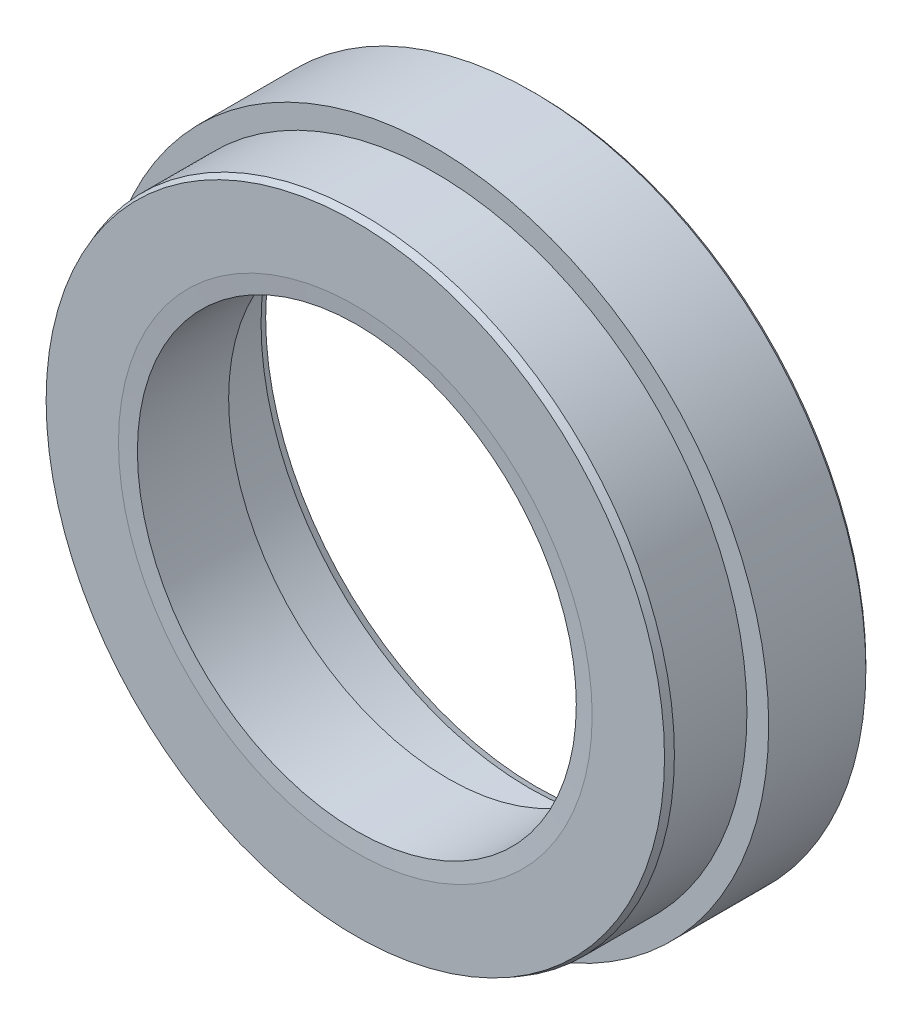
ISO-10303-21;
HEADER;
FILE_DESCRIPTION(('STEP AP214'),'2;1');
FILE_NAME('part.step','',(''),(''),'','','');
FILE_SCHEMA(('AUTOMOTIVE_DESIGN { 1 0 10303 214 1 1 1 1 }'));
ENDSEC;
DATA;
#1=APPLICATION_CONTEXT('core data for automotive mechanical design processes');
#2=APPLICATION_PROTOCOL_DEFINITION('international standard','automotive_design',2000,#1);
#3=PRODUCT_CONTEXT('',#1,'mechanical');
#4=PRODUCT('Part','Part','',(#3));
#5=PRODUCT_RELATED_PRODUCT_CATEGORY('part','',(#4));
#6=PRODUCT_DEFINITION_FORMATION('','',#4);
#7=PRODUCT_DEFINITION_CONTEXT('part definition',#1,'design');
#8=PRODUCT_DEFINITION('design','',#6,#7);
#9=PRODUCT_DEFINITION_SHAPE('','',#8);
#10=(LENGTH_UNIT() NAMED_UNIT(*) SI_UNIT(.MILLI.,.METRE.));
#11=(NAMED_UNIT(*) PLANE_ANGLE_UNIT() SI_UNIT($,.RADIAN.));
#12=(NAMED_UNIT(*) SI_UNIT($,.STERADIAN.) SOLID_ANGLE_UNIT());
#13=UNCERTAINTY_MEASURE_WITH_UNIT(LENGTH_MEASURE(1.E-05),#10,'distance_accuracy_value','');
#14=(GEOMETRIC_REPRESENTATION_CONTEXT(3) GLOBAL_UNCERTAINTY_ASSIGNED_CONTEXT((#13)) GLOBAL_UNIT_ASSIGNED_CONTEXT((#10,
#11,#12)) REPRESENTATION_CONTEXT('',''));
#15=CARTESIAN_POINT('',(0.,0.,0.));
#16=DIRECTION('',(0.,0.,1.));
#17=DIRECTION('',(1.,0.,0.));
#18=AXIS2_PLACEMENT_3D('',#15,#16,#17);
#19=CARTESIAN_POINT('',(7.940681222,19.1705003,5.));
#20=DIRECTION('',(0.,0.,1.));
#21=DIRECTION('',(1.,0.,0.));
#22=AXIS2_PLACEMENT_3D('',#19,#20,#21);
#23=PLANE('',#22);
#24=CARTESIAN_POINT('',(7.940681222,19.1705003,5.));
#25=DIRECTION('',(0.,0.,1.));
#26=DIRECTION('',(-1.,0.,0.));
#27=AXIS2_PLACEMENT_3D('',#24,#25,#26);
#28=CIRCLE('',#27,1.25);
#29=CARTESIAN_POINT('',(6.690681222,19.1705003,5.));
#30=VERTEX_POINT('',#29);
#31=EDGE_CURVE('E10',#30,#30,#28,.T.);
#32=ORIENTED_EDGE('',*,*,#31,.F.);
#33=EDGE_LOOP('',(#32));
#34=FACE_BOUND('',#33,.T.);
#35=ADVANCED_FACE('F15',(#34),#23,.F.);
#36=CARTESIAN_POINT('',(7.940681222,19.1705003,5.));
#37=DIRECTION('',(0.,0.,-1.));
#38=DIRECTION('',(-1.,0.,0.));
#39=AXIS2_PLACEMENT_3D('',#36,#37,#38);
#40=CYLINDRICAL_SURFACE('',#39,1.25);
#41=CARTESIAN_POINT('',(7.940681222,19.1705003,0.));
#42=DIRECTION('',(0.,0.,-1.));
#43=DIRECTION('',(-1.,-3.38987433679E-09,0.));
#44=AXIS2_PLACEMENT_3D('',#41,#42,#43);
#45=CIRCLE('',#44,1.25);
#46=CARTESIAN_POINT('',(6.690681222,19.1705002957627,0.));
#47=VERTEX_POINT('',#46);
#48=EDGE_CURVE('E35',#47,#47,#45,.T.);
#49=ORIENTED_EDGE('',*,*,#48,.T.);
#50=EDGE_LOOP('',(#49));
#51=FACE_BOUND('',#50,.T.);
#52=ORIENTED_EDGE('',*,*,#31,.T.);
#53=EDGE_LOOP('',(#52));
#54=FACE_BOUND('',#53,.T.);
#55=ADVANCED_FACE('F159',(#51,#54),#40,.F.);
#56=CARTESIAN_POINT('',(-19.1705003,-7.940681222,5.));
#57=DIRECTION('',(0.,0.,1.));
#58=DIRECTION('',(1.,0.,0.));
#59=AXIS2_PLACEMENT_3D('',#56,#57,#58);
#60=PLANE('',#59);
#61=CARTESIAN_POINT('',(-19.1705003,-7.940681222,5.));
#62=DIRECTION('',(0.,0.,1.));
#63=DIRECTION('',(-1.,0.,0.));
#64=AXIS2_PLACEMENT_3D('',#61,#62,#63);
#65=CIRCLE('',#64,1.25);
#66=CARTESIAN_POINT('',(-20.4205003,-7.940681222,5.));
#67=VERTEX_POINT('',#66);
#68=EDGE_CURVE('E23',#67,#67,#65,.T.);
#69=ORIENTED_EDGE('',*,*,#68,.F.);
#70=EDGE_LOOP('',(#69));
#71=FACE_BOUND('',#70,.T.);
#72=ADVANCED_FACE('F215',(#71),#60,.F.);
#73=CARTESIAN_POINT('',(-19.1705003,-7.940681222,5.));
#74=DIRECTION('',(0.,0.,-1.));
#75=DIRECTION('',(-1.,0.,0.));
#76=AXIS2_PLACEMENT_3D('',#73,#74,#75);
#77=CYLINDRICAL_SURFACE('',#76,1.25);
#78=CARTESIAN_POINT('',(-19.1705003,-7.940681222,0.));
#79=DIRECTION('',(0.,0.,-1.));
#80=DIRECTION('',(-1.,0.,0.));
#81=AXIS2_PLACEMENT_3D('',#78,#79,#80);
#82=CIRCLE('',#81,1.25);
#83=CARTESIAN_POINT('',(-20.4205003,-7.94068122200002,0.));
#84=VERTEX_POINT('',#83);
#85=EDGE_CURVE('E146',#84,#84,#82,.T.);
#86=ORIENTED_EDGE('',*,*,#85,.T.);
#87=EDGE_LOOP('',(#86));
#88=FACE_BOUND('',#87,.T.);
#89=ORIENTED_EDGE('',*,*,#68,.T.);
#90=EDGE_LOOP('',(#89));
#91=FACE_BOUND('',#90,.T.);
#92=ADVANCED_FACE('F219',(#88,#91),#77,.F.);
#93=CARTESIAN_POINT('',(-7.940681222,-19.1705003,5.));
#94=DIRECTION('',(0.,0.,1.));
#95=DIRECTION('',(1.,0.,0.));
#96=AXIS2_PLACEMENT_3D('',#93,#94,#95);
#97=PLANE('',#96);
#98=CARTESIAN_POINT('',(-7.940681222,-19.1705003,5.));
#99=DIRECTION('',(0.,0.,1.));
#100=DIRECTION('',(-1.,0.,0.));
#101=AXIS2_PLACEMENT_3D('',#98,#99,#100);
#102=CIRCLE('',#101,1.25);
#103=CARTESIAN_POINT('',(-9.190681222,-19.1705003,5.));
#104=VERTEX_POINT('',#103);
#105=EDGE_CURVE('E18',#104,#104,#102,.T.);
#106=ORIENTED_EDGE('',*,*,#105,.F.);
#107=EDGE_LOOP('',(#106));
#108=FACE_BOUND('',#107,.T.);
#109=ADVANCED_FACE('F225',(#108),#97,.F.);
#110=CARTESIAN_POINT('',(-7.940681222,-19.1705003,5.));
#111=DIRECTION('',(0.,0.,-1.));
#112=DIRECTION('',(-1.,0.,0.));
#113=AXIS2_PLACEMENT_3D('',#110,#111,#112);
#114=CYLINDRICAL_SURFACE('',#113,1.25);
#115=CARTESIAN_POINT('',(-7.940681222,-19.1705003,0.));
#116=DIRECTION('',(0.,0.,-1.));
#117=DIRECTION('',(-1.,-3.404463200241E-09,0.));
#118=AXIS2_PLACEMENT_3D('',#115,#116,#117);
#119=CIRCLE('',#118,1.25);
#120=CARTESIAN_POINT('',(-9.190681222,-19.1705003042556,0.));
#121=VERTEX_POINT('',#120);
#122=EDGE_CURVE('E140',#121,#121,#119,.T.);
#123=ORIENTED_EDGE('',*,*,#122,.T.);
#124=EDGE_LOOP('',(#123));
#125=FACE_BOUND('',#124,.T.);
#126=ORIENTED_EDGE('',*,*,#105,.T.);
#127=EDGE_LOOP('',(#126));
#128=FACE_BOUND('',#127,.T.);
#129=ADVANCED_FACE('F228',(#125,#128),#114,.F.);
#130=CARTESIAN_POINT('',(7.940681222,-19.1705003,5.));
#131=DIRECTION('',(0.,0.,1.));
#132=DIRECTION('',(1.,0.,0.));
#133=AXIS2_PLACEMENT_3D('',#130,#131,#132);
#134=PLANE('',#133);
#135=CARTESIAN_POINT('',(7.940681222,-19.1705003,5.));
#136=DIRECTION('',(0.,0.,1.));
#137=DIRECTION('',(-1.,0.,0.));
#138=AXIS2_PLACEMENT_3D('',#135,#136,#137);
#139=CIRCLE('',#138,1.25);
#140=CARTESIAN_POINT('',(6.690681222,-19.1705003,5.));
#141=VERTEX_POINT('',#140);
#142=EDGE_CURVE('E77',#141,#141,#139,.T.);
#143=ORIENTED_EDGE('',*,*,#142,.F.);
#144=EDGE_LOOP('',(#143));
#145=FACE_BOUND('',#144,.T.);
#146=ADVANCED_FACE('F232',(#145),#134,.F.);
#147=CARTESIAN_POINT('',(7.940681222,-19.1705003,5.));
#148=DIRECTION('',(0.,0.,-1.));
#149=DIRECTION('',(-1.,0.,0.));
#150=AXIS2_PLACEMENT_3D('',#147,#148,#149);
#151=CYLINDRICAL_SURFACE('',#150,1.25);
#152=CARTESIAN_POINT('',(7.940681222,-19.1705003,0.));
#153=DIRECTION('',(0.,0.,-1.));
#154=DIRECTION('',(-1.,-3.404463200241E-09,0.));
#155=AXIS2_PLACEMENT_3D('',#152,#153,#154);
#156=CIRCLE('',#155,1.25);
#157=CARTESIAN_POINT('',(6.690681222,-19.1705003042556,0.));
#158=VERTEX_POINT('',#157);
#159=EDGE_CURVE('E130',#158,#158,#156,.T.);
#160=ORIENTED_EDGE('',*,*,#159,.T.);
#161=EDGE_LOOP('',(#160));
#162=FACE_BOUND('',#161,.T.);
#163=ORIENTED_EDGE('',*,*,#142,.T.);
#164=EDGE_LOOP('',(#163));
#165=FACE_BOUND('',#164,.T.);
#166=ADVANCED_FACE('F236',(#162,#165),#151,.F.);
#167=CARTESIAN_POINT('',(19.1705003,-7.940681222,5.));
#168=DIRECTION('',(0.,0.,1.));
#169=DIRECTION('',(1.,0.,0.));
#170=AXIS2_PLACEMENT_3D('',#167,#168,#169);
#171=PLANE('',#170);
#172=CARTESIAN_POINT('',(19.1705003,-7.940681222,5.));
#173=DIRECTION('',(0.,0.,1.));
#174=DIRECTION('',(-1.,0.,0.));
#175=AXIS2_PLACEMENT_3D('',#172,#173,#174);
#176=CIRCLE('',#175,1.25);
#177=CARTESIAN_POINT('',(17.9205003,-7.940681222,5.));
#178=VERTEX_POINT('',#177);
#179=EDGE_CURVE('E74',#178,#178,#176,.T.);
#180=ORIENTED_EDGE('',*,*,#179,.F.);
#181=EDGE_LOOP('',(#180));
#182=FACE_BOUND('',#181,.T.);
#183=ADVANCED_FACE('F240',(#182),#171,.F.);
#184=CARTESIAN_POINT('',(19.1705003,-7.940681222,5.));
#185=DIRECTION('',(0.,0.,-1.));
#186=DIRECTION('',(-1.,0.,0.));
#187=AXIS2_PLACEMENT_3D('',#184,#185,#186);
#188=CYLINDRICAL_SURFACE('',#187,1.25);
#189=CARTESIAN_POINT('',(19.1705003,-7.940681222,0.));
#190=DIRECTION('',(0.,0.,-1.));
#191=DIRECTION('',(-1.,0.,0.));
#192=AXIS2_PLACEMENT_3D('',#189,#190,#191);
#193=CIRCLE('',#192,1.25);
#194=CARTESIAN_POINT('',(17.9205003,-7.94068122200002,0.));
#195=VERTEX_POINT('',#194);
#196=EDGE_CURVE('E126',#195,#195,#193,.T.);
#197=ORIENTED_EDGE('',*,*,#196,.T.);
#198=EDGE_LOOP('',(#197));
#199=FACE_BOUND('',#198,.T.);
#200=ORIENTED_EDGE('',*,*,#179,.T.);
#201=EDGE_LOOP('',(#200));
#202=FACE_BOUND('',#201,.T.);
#203=ADVANCED_FACE('F242',(#199,#202),#188,.F.);
#204=CARTESIAN_POINT('',(-19.1705003,7.940681222,5.));
#205=DIRECTION('',(0.,0.,1.));
#206=DIRECTION('',(1.,0.,0.));
#207=AXIS2_PLACEMENT_3D('',#204,#205,#206);
#208=PLANE('',#207);
#209=CARTESIAN_POINT('',(-19.1705003,7.940681222,5.));
#210=DIRECTION('',(0.,0.,1.));
#211=DIRECTION('',(-1.,0.,0.));
#212=AXIS2_PLACEMENT_3D('',#209,#210,#211);
#213=CIRCLE('',#212,1.25);
#214=CARTESIAN_POINT('',(-20.4205003,7.940681222,5.));
#215=VERTEX_POINT('',#214);
#216=EDGE_CURVE('E71',#215,#215,#213,.T.);
#217=ORIENTED_EDGE('',*,*,#216,.F.);
#218=EDGE_LOOP('',(#217));
#219=FACE_BOUND('',#218,.T.);
#220=ADVANCED_FACE('F245',(#219),#208,.F.);
#221=CARTESIAN_POINT('',(-19.1705003,7.940681222,5.));
#222=DIRECTION('',(0.,0.,-1.));
#223=DIRECTION('',(-1.,0.,0.));
#224=AXIS2_PLACEMENT_3D('',#221,#222,#223);
#225=CYLINDRICAL_SURFACE('',#224,1.25);
#226=CARTESIAN_POINT('',(-19.1705003,7.940681222,0.));
#227=DIRECTION('',(0.,0.,-1.));
#228=DIRECTION('',(-1.,0.,0.));
#229=AXIS2_PLACEMENT_3D('',#226,#227,#228);
#230=CIRCLE('',#229,1.25);
#231=CARTESIAN_POINT('',(-20.4205003,7.94068122200002,0.));
#232=VERTEX_POINT('',#231);
#233=EDGE_CURVE('E125',#232,#232,#230,.T.);
#234=ORIENTED_EDGE('',*,*,#233,.T.);
#235=EDGE_LOOP('',(#234));
#236=FACE_BOUND('',#235,.T.);
#237=ORIENTED_EDGE('',*,*,#216,.T.);
#238=EDGE_LOOP('',(#237));
#239=FACE_BOUND('',#238,.T.);
#240=ADVANCED_FACE('F249',(#236,#239),#225,.F.);
#241=CARTESIAN_POINT('',(-7.940681222,19.1705003,5.));
#242=DIRECTION('',(0.,0.,1.));
#243=DIRECTION('',(1.,0.,0.));
#244=AXIS2_PLACEMENT_3D('',#241,#242,#243);
#245=PLANE('',#244);
#246=CARTESIAN_POINT('',(-7.940681222,19.1705003,5.));
#247=DIRECTION('',(0.,0.,1.));
#248=DIRECTION('',(-1.,0.,0.));
#249=AXIS2_PLACEMENT_3D('',#246,#247,#248);
#250=CIRCLE('',#249,1.25);
#251=CARTESIAN_POINT('',(-9.190681222,19.1705003,5.));
#252=VERTEX_POINT('',#251);
#253=EDGE_CURVE('E67',#252,#252,#250,.T.);
#254=ORIENTED_EDGE('',*,*,#253,.F.);
#255=EDGE_LOOP('',(#254));
#256=FACE_BOUND('',#255,.T.);
#257=ADVANCED_FACE('F253',(#256),#245,.F.);
#258=CARTESIAN_POINT('',(-7.940681222,19.1705003,5.));
#259=DIRECTION('',(0.,0.,-1.));
#260=DIRECTION('',(-1.,0.,0.));
#261=AXIS2_PLACEMENT_3D('',#258,#259,#260);
#262=CYLINDRICAL_SURFACE('',#261,1.25);
#263=CARTESIAN_POINT('',(-7.940681222,19.1705003,0.));
#264=DIRECTION('',(0.,0.,-1.));
#265=DIRECTION('',(-1.,-3.38987433679E-09,0.));
#266=AXIS2_PLACEMENT_3D('',#263,#264,#265);
#267=CIRCLE('',#266,1.25);
#268=CARTESIAN_POINT('',(-9.190681222,19.1705002957627,0.));
#269=VERTEX_POINT('',#268);
#270=EDGE_CURVE('E121',#269,#269,#267,.T.);
#271=ORIENTED_EDGE('',*,*,#270,.T.);
#272=EDGE_LOOP('',(#271));
#273=FACE_BOUND('',#272,.T.);
#274=ORIENTED_EDGE('',*,*,#253,.T.);
#275=EDGE_LOOP('',(#274));
#276=FACE_BOUND('',#275,.T.);
#277=ADVANCED_FACE('F256',(#273,#276),#262,.F.);
#278=CARTESIAN_POINT('',(19.1705003,7.940681222,5.));
#279=DIRECTION('',(0.,0.,1.));
#280=DIRECTION('',(1.,0.,0.));
#281=AXIS2_PLACEMENT_3D('',#278,#279,#280);
#282=PLANE('',#281);
#283=CARTESIAN_POINT('',(19.1705003,7.940681222,5.));
#284=DIRECTION('',(0.,0.,1.));
#285=DIRECTION('',(-1.,0.,0.));
#286=AXIS2_PLACEMENT_3D('',#283,#284,#285);
#287=CIRCLE('',#286,1.25);
#288=CARTESIAN_POINT('',(17.9205003,7.940681222,5.));
#289=VERTEX_POINT('',#288);
#290=EDGE_CURVE('E60',#289,#289,#287,.T.);
#291=ORIENTED_EDGE('',*,*,#290,.F.);
#292=EDGE_LOOP('',(#291));
#293=FACE_BOUND('',#292,.T.);
#294=ADVANCED_FACE('F261',(#293),#282,.F.);
#295=CARTESIAN_POINT('',(19.1705003,7.940681222,5.));
#296=DIRECTION('',(0.,0.,-1.));
#297=DIRECTION('',(-1.,0.,0.));
#298=AXIS2_PLACEMENT_3D('',#295,#296,#297);
#299=CYLINDRICAL_SURFACE('',#298,1.25);
#300=CARTESIAN_POINT('',(19.1705003,7.940681222,0.));
#301=DIRECTION('',(0.,0.,-1.));
#302=DIRECTION('',(-1.,0.,0.));
#303=AXIS2_PLACEMENT_3D('',#300,#301,#302);
#304=CIRCLE('',#303,1.25);
#305=CARTESIAN_POINT('',(17.9205003,7.94068122200002,0.));
#306=VERTEX_POINT('',#305);
#307=EDGE_CURVE('E120',#306,#306,#304,.T.);
#308=ORIENTED_EDGE('',*,*,#307,.T.);
#309=EDGE_LOOP('',(#308));
#310=FACE_BOUND('',#309,.T.);
#311=ORIENTED_EDGE('',*,*,#290,.T.);
#312=EDGE_LOOP('',(#311));
#313=FACE_BOUND('',#312,.T.);
#314=ADVANCED_FACE('F263',(#310,#313),#299,.F.);
#315=CARTESIAN_POINT('',(0.,0.,12.395013604));
#316=DIRECTION('',(0.,0.,-1.));
#317=DIRECTION('',(-1.,0.,0.));
#318=AXIS2_PLACEMENT_3D('',#315,#316,#317);
#319=CYLINDRICAL_SURFACE('',#318,15.13);
#320=CARTESIAN_POINT('',(0.,0.,6.104986396));
#321=DIRECTION('',(0.,0.,-1.));
#322=DIRECTION('',(1.,-2.387071537031E-10,0.));
#323=AXIS2_PLACEMENT_3D('',#320,#321,#322);
#324=CIRCLE('',#323,15.13);
#325=CARTESIAN_POINT('',(15.13,-3.6116392355279E-09,6.104986396));
#326=VERTEX_POINT('',#325);
#327=EDGE_CURVE('E104',#326,#326,#324,.T.);
#328=ORIENTED_EDGE('',*,*,#327,.T.);
#329=EDGE_LOOP('',(#328));
#330=FACE_BOUND('',#329,.T.);
#331=CARTESIAN_POINT('',(0.,0.,12.395013604));
#332=DIRECTION('',(0.,0.,1.));
#333=DIRECTION('',(-1.,0.,0.));
#334=AXIS2_PLACEMENT_3D('',#331,#332,#333);
#335=CIRCLE('',#334,15.13);
#336=CARTESIAN_POINT('',(-15.13,0.,12.395013604));
#337=VERTEX_POINT('',#336);
#338=EDGE_CURVE('E42',#337,#337,#335,.T.);
#339=ORIENTED_EDGE('',*,*,#338,.T.);
#340=EDGE_LOOP('',(#339));
#341=FACE_BOUND('',#340,.T.);
#342=ADVANCED_FACE('F266',(#330,#341),#319,.F.);
#343=CARTESIAN_POINT('',(0.,0.,12.447506802));
#344=DIRECTION('',(0.,0.,1.));
#345=DIRECTION('',(1.,0.,0.));
#346=AXIS2_PLACEMENT_3D('',#343,#344,#345);
#347=CONICAL_SURFACE('',#346,15.73,1.48352986438601);
#348=CARTESIAN_POINT('',(0.,0.,12.5));
#349=DIRECTION('',(0.,0.,1.));
#350=DIRECTION('',(1.,0.,0.));
#351=AXIS2_PLACEMENT_3D('',#348,#349,#350);
#352=CIRCLE('',#351,16.33);
#353=CARTESIAN_POINT('',(16.33,0.,12.5));
#354=VERTEX_POINT('',#353);
#355=EDGE_CURVE('E38',#354,#354,#352,.T.);
#356=ORIENTED_EDGE('',*,*,#355,.T.);
#357=EDGE_LOOP('',(#356));
#358=FACE_BOUND('',#357,.T.);
#359=ORIENTED_EDGE('',*,*,#338,.F.);
#360=EDGE_LOOP('',(#359));
#361=FACE_BOUND('',#360,.T.);
#362=ADVANCED_FACE('F270',(#358,#361),#347,.F.);
#363=CARTESIAN_POINT('',(0.,0.,12.5));
#364=DIRECTION('',(0.,0.,1.));
#365=DIRECTION('',(1.,0.,0.));
#366=AXIS2_PLACEMENT_3D('',#363,#364,#365);
#367=PLANE('',#366);
#368=ORIENTED_EDGE('',*,*,#355,.F.);
#369=EDGE_LOOP('',(#368));
#370=FACE_BOUND('',#369,.T.);
#371=CARTESIAN_POINT('',(0.,0.,12.5));
#372=DIRECTION('',(0.,0.,-1.));
#373=DIRECTION('',(-1.,0.,0.));
#374=AXIS2_PLACEMENT_3D('',#371,#372,#373);
#375=CIRCLE('',#374,21.318014883);
#376=CARTESIAN_POINT('',(-21.318014883,0.,12.5));
#377=VERTEX_POINT('',#376);
#378=EDGE_CURVE('E43',#377,#377,#375,.T.);
#379=ORIENTED_EDGE('',*,*,#378,.F.);
#380=EDGE_LOOP('',(#379));
#381=FACE_BOUND('',#380,.T.);
#382=ADVANCED_FACE('F274',(#370,#381),#367,.T.);
#383=CARTESIAN_POINT('',(0.,0.,12.25));
#384=DIRECTION('',(0.,0.,-1.));
#385=DIRECTION('',(-1.,0.,0.));
#386=AXIS2_PLACEMENT_3D('',#383,#384,#385);
#387=CONICAL_SURFACE('',#386,21.4090074415,0.349065850163704);
#388=ORIENTED_EDGE('',*,*,#378,.T.);
#389=EDGE_LOOP('',(#388));
#390=FACE_BOUND('',#389,.T.);
#391=CARTESIAN_POINT('',(0.,0.,12.));
#392=DIRECTION('',(0.,0.,-1.));
#393=DIRECTION('',(1.,-2.84929290932E-10,0.));
#394=AXIS2_PLACEMENT_3D('',#391,#392,#393);
#395=CIRCLE('',#394,21.5);
#396=CARTESIAN_POINT('',(21.5,-6.125979755038E-09,12.));
#397=VERTEX_POINT('',#396);
#398=EDGE_CURVE('E56',#397,#397,#395,.T.);
#399=ORIENTED_EDGE('',*,*,#398,.F.);
#400=EDGE_LOOP('',(#399));
#401=FACE_BOUND('',#400,.T.);
#402=ADVANCED_FACE('F204',(#390,#401),#387,.T.);
#403=CARTESIAN_POINT('',(0.,0.,12.));
#404=DIRECTION('',(0.,0.,-1.));
#405=DIRECTION('',(-1.,0.,0.));
#406=AXIS2_PLACEMENT_3D('',#403,#404,#405);
#407=CYLINDRICAL_SURFACE('',#406,21.5);
#408=CARTESIAN_POINT('',(0.,0.,7.));
#409=DIRECTION('',(0.,0.,1.));
#410=DIRECTION('',(1.,0.,0.));
#411=AXIS2_PLACEMENT_3D('',#408,#409,#410);
#412=CIRCLE('',#411,21.5);
#413=CARTESIAN_POINT('',(21.5,0.,7.));
#414=VERTEX_POINT('',#413);
#415=EDGE_CURVE('E52',#414,#414,#412,.T.);
#416=ORIENTED_EDGE('',*,*,#415,.T.);
#417=EDGE_LOOP('',(#416));
#418=FACE_BOUND('',#417,.T.);
#419=ORIENTED_EDGE('',*,*,#398,.T.);
#420=EDGE_LOOP('',(#419));
#421=FACE_BOUND('',#420,.T.);
#422=ADVANCED_FACE('F197',(#418,#421),#407,.T.);
#423=CARTESIAN_POINT('',(0.,0.,7.));
#424=DIRECTION('',(0.,0.,1.));
#425=DIRECTION('',(1.,0.,0.));
#426=AXIS2_PLACEMENT_3D('',#423,#424,#425);
#427=PLANE('',#426);
#428=ORIENTED_EDGE('',*,*,#415,.F.);
#429=EDGE_LOOP('',(#428));
#430=FACE_BOUND('',#429,.T.);
#431=CARTESIAN_POINT('',(0.,0.,7.));
#432=DIRECTION('',(0.,0.,-1.));
#433=DIRECTION('',(1.,0.,0.));
#434=AXIS2_PLACEMENT_3D('',#431,#432,#433);
#435=CIRCLE('',#434,23.);
#436=CARTESIAN_POINT('',(23.,0.,7.));
#437=VERTEX_POINT('',#436);
#438=EDGE_CURVE('E48',#437,#437,#435,.T.);
#439=ORIENTED_EDGE('',*,*,#438,.F.);
#440=EDGE_LOOP('',(#439));
#441=FACE_BOUND('',#440,.T.);
#442=ADVANCED_FACE('F192',(#430,#441),#427,.T.);
#443=CARTESIAN_POINT('',(0.,0.,7.));
#444=DIRECTION('',(0.,0.,-1.));
#445=DIRECTION('',(-1.,0.,0.));
#446=AXIS2_PLACEMENT_3D('',#443,#444,#445);
#447=CYLINDRICAL_SURFACE('',#446,23.);
#448=CARTESIAN_POINT('',(0.,0.,0.3));
#449=DIRECTION('',(0.,0.,1.));
#450=DIRECTION('',(1.,-1.395833334401E-10,0.));
#451=AXIS2_PLACEMENT_3D('',#448,#449,#450);
#452=CIRCLE('',#451,23.);
#453=CARTESIAN_POINT('',(23.,-3.2104166691223E-09,0.3));
#454=VERTEX_POINT('',#453);
#455=EDGE_CURVE('E44',#454,#454,#452,.T.);
#456=ORIENTED_EDGE('',*,*,#455,.T.);
#457=EDGE_LOOP('',(#456));
#458=FACE_BOUND('',#457,.T.);
#459=ORIENTED_EDGE('',*,*,#438,.T.);
#460=EDGE_LOOP('',(#459));
#461=FACE_BOUND('',#460,.T.);
#462=ADVANCED_FACE('F186',(#458,#461),#447,.T.);
#463=CARTESIAN_POINT('',(0.,0.,0.15));
#464=DIRECTION('',(0.,0.,1.));
#465=DIRECTION('',(1.,0.,0.));
#466=AXIS2_PLACEMENT_3D('',#463,#464,#465);
#467=CONICAL_SURFACE('',#466,22.85,0.7853981633973);
#468=CARTESIAN_POINT('',(0.,0.,0.));
#469=DIRECTION('',(0.,0.,1.));
#470=DIRECTION('',(-1.,0.,0.));
#471=AXIS2_PLACEMENT_3D('',#468,#469,#470);
#472=CIRCLE('',#471,22.7);
#473=CARTESIAN_POINT('',(-22.7,0.,0.));
#474=VERTEX_POINT('',#473);
#475=EDGE_CURVE('E116',#474,#474,#472,.T.);
#476=ORIENTED_EDGE('',*,*,#475,.T.);
#477=EDGE_LOOP('',(#476));
#478=FACE_BOUND('',#477,.T.);
#479=ORIENTED_EDGE('',*,*,#455,.F.);
#480=EDGE_LOOP('',(#479));
#481=FACE_BOUND('',#480,.T.);
#482=ADVANCED_FACE('F165',(#478,#481),#467,.T.);
#483=CARTESIAN_POINT('',(0.,0.,0.));
#484=DIRECTION('',(0.,0.,1.));
#485=DIRECTION('',(1.,0.,0.));
#486=AXIS2_PLACEMENT_3D('',#483,#484,#485);
#487=PLANE('',#486);
#488=ORIENTED_EDGE('',*,*,#48,.F.);
#489=EDGE_LOOP('',(#488));
#490=FACE_BOUND('',#489,.T.);
#491=ORIENTED_EDGE('',*,*,#85,.F.);
#492=EDGE_LOOP('',(#491));
#493=FACE_BOUND('',#492,.T.);
#494=ORIENTED_EDGE('',*,*,#122,.F.);
#495=EDGE_LOOP('',(#494));
#496=FACE_BOUND('',#495,.T.);
#497=ORIENTED_EDGE('',*,*,#159,.F.);
#498=EDGE_LOOP('',(#497));
#499=FACE_BOUND('',#498,.T.);
#500=ORIENTED_EDGE('',*,*,#196,.F.);
#501=EDGE_LOOP('',(#500));
#502=FACE_BOUND('',#501,.T.);
#503=ORIENTED_EDGE('',*,*,#233,.F.);
#504=EDGE_LOOP('',(#503));
#505=FACE_BOUND('',#504,.T.);
#506=ORIENTED_EDGE('',*,*,#270,.F.);
#507=EDGE_LOOP('',(#506));
#508=FACE_BOUND('',#507,.T.);
#509=ORIENTED_EDGE('',*,*,#307,.F.);
#510=EDGE_LOOP('',(#509));
#511=FACE_BOUND('',#510,.T.);
#512=CARTESIAN_POINT('',(0.,0.,0.));
#513=DIRECTION('',(0.,0.,-1.));
#514=DIRECTION('',(-1.,0.,0.));
#515=AXIS2_PLACEMENT_3D('',#512,#513,#514);
#516=CIRCLE('',#515,18.681985117);
#517=CARTESIAN_POINT('',(-18.681985117,0.,0.));
#518=VERTEX_POINT('',#517);
#519=EDGE_CURVE('E112',#518,#518,#516,.T.);
#520=ORIENTED_EDGE('',*,*,#519,.F.);
#521=EDGE_LOOP('',(#520));
#522=FACE_BOUND('',#521,.T.);
#523=ORIENTED_EDGE('',*,*,#475,.F.);
#524=EDGE_LOOP('',(#523));
#525=FACE_BOUND('',#524,.T.);
#526=ADVANCED_FACE('F161',(#490,#493,#496,#499,#502,#505,#508,#511,#522,#525),#487,.F.);
#527=CARTESIAN_POINT('',(0.,0.,0.25));
#528=DIRECTION('',(0.,0.,-1.));
#529=DIRECTION('',(-1.,0.,0.));
#530=AXIS2_PLACEMENT_3D('',#527,#528,#529);
#531=CONICAL_SURFACE('',#530,18.5909925585,0.349065850163704);
#532=ORIENTED_EDGE('',*,*,#519,.T.);
#533=EDGE_LOOP('',(#532));
#534=FACE_BOUND('',#533,.T.);
#535=CARTESIAN_POINT('',(0.,0.,0.5));
#536=DIRECTION('',(0.,0.,-1.));
#537=DIRECTION('',(-1.,0.,0.));
#538=AXIS2_PLACEMENT_3D('',#535,#536,#537);
#539=CIRCLE('',#538,18.5);
#540=CARTESIAN_POINT('',(-18.5,0.,0.5));
#541=VERTEX_POINT('',#540);
#542=EDGE_CURVE('E108',#541,#541,#539,.T.);
#543=ORIENTED_EDGE('',*,*,#542,.F.);
#544=EDGE_LOOP('',(#543));
#545=FACE_BOUND('',#544,.T.);
#546=ADVANCED_FACE('F164',(#534,#545),#531,.F.);
#547=CARTESIAN_POINT('',(0.,0.,5.5));
#548=DIRECTION('',(0.,0.,-1.));
#549=DIRECTION('',(-1.,0.,0.));
#550=AXIS2_PLACEMENT_3D('',#547,#548,#549);
#551=CYLINDRICAL_SURFACE('',#550,18.5);
#552=ORIENTED_EDGE('',*,*,#542,.T.);
#553=EDGE_LOOP('',(#552));
#554=FACE_BOUND('',#553,.T.);
#555=CARTESIAN_POINT('',(0.,0.,5.5));
#556=DIRECTION('',(0.,0.,1.));
#557=DIRECTION('',(-1.,0.,0.));
#558=AXIS2_PLACEMENT_3D('',#555,#556,#557);
#559=CIRCLE('',#558,18.5);
#560=CARTESIAN_POINT('',(-18.5,0.,5.5));
#561=VERTEX_POINT('',#560);
#562=EDGE_CURVE('E93',#561,#561,#559,.T.);
#563=ORIENTED_EDGE('',*,*,#562,.T.);
#564=EDGE_LOOP('',(#563));
#565=FACE_BOUND('',#564,.T.);
#566=ADVANCED_FACE('F288',(#554,#565),#551,.F.);
#567=CARTESIAN_POINT('',(0.,0.,5.5));
#568=DIRECTION('',(0.,0.,1.));
#569=DIRECTION('',(1.,0.,0.));
#570=AXIS2_PLACEMENT_3D('',#567,#568,#569);
#571=PLANE('',#570);
#572=CARTESIAN_POINT('',(0.,0.,5.5));
#573=DIRECTION('',(0.,0.,-1.));
#574=DIRECTION('',(-1.,0.,0.));
#575=AXIS2_PLACEMENT_3D('',#572,#573,#574);
#576=CIRCLE('',#575,17.5);
#577=CARTESIAN_POINT('',(-17.5,0.,5.5));
#578=VERTEX_POINT('',#577);
#579=EDGE_CURVE('E99',#578,#578,#576,.T.);
#580=ORIENTED_EDGE('',*,*,#579,.F.);
#581=EDGE_LOOP('',(#580));
#582=FACE_BOUND('',#581,.T.);
#583=ORIENTED_EDGE('',*,*,#562,.F.);
#584=EDGE_LOOP('',(#583));
#585=FACE_BOUND('',#584,.T.);
#586=ADVANCED_FACE('F291',(#582,#585),#571,.F.);
#587=CARTESIAN_POINT('',(0.,0.,6.));
#588=DIRECTION('',(0.,0.,-1.));
#589=DIRECTION('',(-1.,0.,0.));
#590=AXIS2_PLACEMENT_3D('',#587,#588,#589);
#591=CYLINDRICAL_SURFACE('',#590,17.5);
#592=ORIENTED_EDGE('',*,*,#579,.T.);
#593=EDGE_LOOP('',(#592));
#594=FACE_BOUND('',#593,.T.);
#595=CARTESIAN_POINT('',(0.,0.,6.));
#596=DIRECTION('',(0.,0.,1.));
#597=DIRECTION('',(-1.,0.,0.));
#598=AXIS2_PLACEMENT_3D('',#595,#596,#597);
#599=CIRCLE('',#598,17.5);
#600=CARTESIAN_POINT('',(-17.5,0.,6.));
#601=VERTEX_POINT('',#600);
#602=EDGE_CURVE('E95',#601,#601,#599,.T.);
#603=ORIENTED_EDGE('',*,*,#602,.T.);
#604=EDGE_LOOP('',(#603));
#605=FACE_BOUND('',#604,.T.);
#606=ADVANCED_FACE('F296',(#594,#605),#591,.F.);
#607=CARTESIAN_POINT('',(0.,0.,6.));
#608=DIRECTION('',(0.,0.,1.));
#609=DIRECTION('',(1.,0.,0.));
#610=AXIS2_PLACEMENT_3D('',#607,#608,#609);
#611=PLANE('',#610);
#612=CARTESIAN_POINT('',(0.,0.,6.));
#613=DIRECTION('',(0.,0.,-1.));
#614=DIRECTION('',(1.,0.,0.));
#615=AXIS2_PLACEMENT_3D('',#612,#613,#614);
#616=CIRCLE('',#615,16.33);
#617=CARTESIAN_POINT('',(16.33,0.,6.));
#618=VERTEX_POINT('',#617);
#619=EDGE_CURVE('E100',#618,#618,#616,.T.);
#620=ORIENTED_EDGE('',*,*,#619,.F.);
#621=EDGE_LOOP('',(#620));
#622=FACE_BOUND('',#621,.T.);
#623=ORIENTED_EDGE('',*,*,#602,.F.);
#624=EDGE_LOOP('',(#623));
#625=FACE_BOUND('',#624,.T.);
#626=ADVANCED_FACE('F301',(#622,#625),#611,.F.);
#627=CARTESIAN_POINT('',(0.,0.,6.052493198));
#628=DIRECTION('',(0.,0.,-1.));
#629=DIRECTION('',(-1.,0.,0.));
#630=AXIS2_PLACEMENT_3D('',#627,#628,#629);
#631=CONICAL_SURFACE('',#630,15.73,1.48352986438601);
#632=ORIENTED_EDGE('',*,*,#619,.T.);
#633=EDGE_LOOP('',(#632));
#634=FACE_BOUND('',#633,.T.);
#635=ORIENTED_EDGE('',*,*,#327,.F.);
#636=EDGE_LOOP('',(#635));
#637=FACE_BOUND('',#636,.T.);
#638=ADVANCED_FACE('F333',(#634,#637),#631,.F.);
#639=CLOSED_SHELL('',(#35,#55,#72,#92,#109,#129,#146,#166,#183,#203,#220,#240,#257,#277,#294,
#314,#342,#362,#382,#402,#422,#442,#462,#482,#526,#546,#566,#586,#606,#626,#638));
#640=MANIFOLD_SOLID_BREP('B1',#639);
#641=ADVANCED_BREP_SHAPE_REPRESENTATION('',(#18,#640),#14);
#642=SHAPE_DEFINITION_REPRESENTATION(#9,#641);
ENDSEC;
END-ISO-10303-21;
